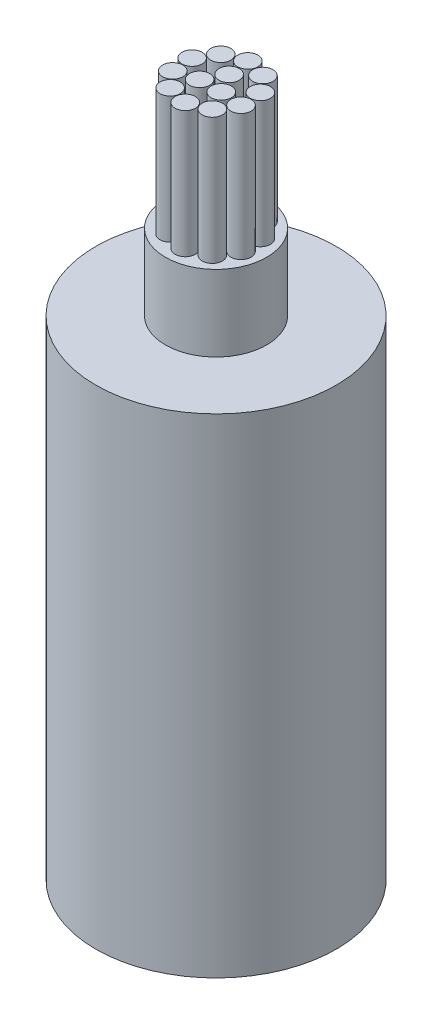
ISO-10303-21;
HEADER;
FILE_DESCRIPTION(('STEP AP214'),'2;1');
FILE_NAME('part.step','',(''),(''),'','','');
FILE_SCHEMA(('AUTOMOTIVE_DESIGN { 1 0 10303 214 1 1 1 1 }'));
ENDSEC;
DATA;
#1=APPLICATION_CONTEXT('core data for automotive mechanical design processes');
#2=APPLICATION_PROTOCOL_DEFINITION('international standard','automotive_design',2000,#1);
#3=PRODUCT_CONTEXT('',#1,'mechanical');
#4=PRODUCT('Part','Part','',(#3));
#5=PRODUCT_RELATED_PRODUCT_CATEGORY('part','',(#4));
#6=PRODUCT_DEFINITION_FORMATION('','',#4);
#7=PRODUCT_DEFINITION_CONTEXT('part definition',#1,'design');
#8=PRODUCT_DEFINITION('design','',#6,#7);
#9=PRODUCT_DEFINITION_SHAPE('','',#8);
#10=(LENGTH_UNIT() NAMED_UNIT(*) SI_UNIT(.MILLI.,.METRE.));
#11=(NAMED_UNIT(*) PLANE_ANGLE_UNIT() SI_UNIT($,.RADIAN.));
#12=(NAMED_UNIT(*) SI_UNIT($,.STERADIAN.) SOLID_ANGLE_UNIT());
#13=UNCERTAINTY_MEASURE_WITH_UNIT(LENGTH_MEASURE(1.E-05),#10,'distance_accuracy_value','');
#14=(GEOMETRIC_REPRESENTATION_CONTEXT(3) GLOBAL_UNCERTAINTY_ASSIGNED_CONTEXT((#13)) GLOBAL_UNIT_ASSIGNED_CONTEXT((#10,
#11,#12)) REPRESENTATION_CONTEXT('',''));
#15=CARTESIAN_POINT('',(0.,0.,0.));
#16=DIRECTION('',(0.,0.,1.));
#17=DIRECTION('',(1.,0.,0.));
#18=AXIS2_PLACEMENT_3D('',#15,#16,#17);
#19=CARTESIAN_POINT('',(0.,-3.5,0.));
#20=DIRECTION('',(0.,1.,0.));
#21=DIRECTION('',(0.,0.,1.));
#22=AXIS2_PLACEMENT_3D('',#19,#20,#21);
#23=CYLINDRICAL_SURFACE('',#22,4.75);
#24=CARTESIAN_POINT('',(0.,19.3,0.));
#25=DIRECTION('',(0.,1.,0.));
#26=DIRECTION('',(0.,0.,1.));
#27=AXIS2_PLACEMENT_3D('',#24,#25,#26);
#28=CIRCLE('',#27,4.75);
#29=CARTESIAN_POINT('',(0.,19.3,4.75));
#30=VERTEX_POINT('',#29);
#31=EDGE_CURVE('E129',#30,#30,#28,.T.);
#32=ORIENTED_EDGE('',*,*,#31,.F.);
#33=EDGE_LOOP('',(#32));
#34=FACE_BOUND('',#33,.T.);
#35=CARTESIAN_POINT('',(0.,0.,0.));
#36=DIRECTION('',(0.,1.,0.));
#37=DIRECTION('',(0.,0.,1.));
#38=AXIS2_PLACEMENT_3D('',#35,#36,#37);
#39=CIRCLE('',#38,4.75);
#40=CARTESIAN_POINT('',(0.,0.,4.75));
#41=VERTEX_POINT('',#40);
#42=EDGE_CURVE('E132',#41,#41,#39,.T.);
#43=ORIENTED_EDGE('',*,*,#42,.T.);
#44=EDGE_LOOP('',(#43));
#45=FACE_BOUND('',#44,.T.);
#46=ADVANCED_FACE('F37',(#34,#45),#23,.T.);
#47=CARTESIAN_POINT('',(0.,22.3,0.));
#48=DIRECTION('',(0.,-1.,0.));
#49=DIRECTION('',(0.,0.,-1.));
#50=AXIS2_PLACEMENT_3D('',#47,#48,#49);
#51=CYLINDRICAL_SURFACE('',#50,2.);
#52=CARTESIAN_POINT('',(0.,22.3,0.));
#53=DIRECTION('',(0.,1.,0.));
#54=DIRECTION('',(0.,0.,1.));
#55=AXIS2_PLACEMENT_3D('',#52,#53,#54);
#56=CIRCLE('',#55,2.);
#57=CARTESIAN_POINT('',(0.,22.3,2.));
#58=VERTEX_POINT('',#57);
#59=EDGE_CURVE('E10',#58,#58,#56,.T.);
#60=ORIENTED_EDGE('',*,*,#59,.F.);
#61=EDGE_LOOP('',(#60));
#62=FACE_BOUND('',#61,.T.);
#63=CARTESIAN_POINT('',(0.,19.3,0.));
#64=DIRECTION('',(0.,1.,0.));
#65=DIRECTION('',(0.,0.,1.));
#66=AXIS2_PLACEMENT_3D('',#63,#64,#65);
#67=CIRCLE('',#66,2.);
#68=CARTESIAN_POINT('',(0.,19.3,2.));
#69=VERTEX_POINT('',#68);
#70=EDGE_CURVE('E124',#69,#69,#67,.T.);
#71=ORIENTED_EDGE('',*,*,#70,.T.);
#72=EDGE_LOOP('',(#71));
#73=FACE_BOUND('',#72,.T.);
#74=ADVANCED_FACE('F146',(#62,#73),#51,.T.);
#75=CARTESIAN_POINT('',(0.,22.3,0.));
#76=DIRECTION('',(0.,1.,0.));
#77=DIRECTION('',(0.,0.,1.));
#78=AXIS2_PLACEMENT_3D('',#75,#76,#77);
#79=PLANE('',#78);
#80=CARTESIAN_POINT('',(0.441742202494932,22.3,0.237271906655678));
#81=DIRECTION('',(0.,1.,0.));
#82=DIRECTION('',(0.,0.,1.));
#83=AXIS2_PLACEMENT_3D('',#80,#81,#82);
#84=CIRCLE('',#83,0.4);
#85=CARTESIAN_POINT('',(0.441742202494932,22.3,0.637271906655679));
#86=VERTEX_POINT('',#85);
#87=EDGE_CURVE('E121',#86,#86,#84,.T.);
#88=ORIENTED_EDGE('',*,*,#87,.F.);
#89=EDGE_LOOP('',(#88));
#90=FACE_BOUND('',#89,.T.);
#91=CARTESIAN_POINT('',(-0.853764908428897,22.3,-1.03916544719868));
#92=DIRECTION('',(0.,1.,0.));
#93=DIRECTION('',(0.,0.,1.));
#94=AXIS2_PLACEMENT_3D('',#91,#92,#93);
#95=CIRCLE('',#94,0.4);
#96=CARTESIAN_POINT('',(-0.853764908428897,22.3,-0.639165447198683));
#97=VERTEX_POINT('',#96);
#98=EDGE_CURVE('E115',#97,#97,#95,.T.);
#99=ORIENTED_EDGE('',*,*,#98,.F.);
#100=EDGE_LOOP('',(#99));
#101=FACE_BOUND('',#100,.T.);
#102=CARTESIAN_POINT('',(-1.29013475974732,22.3,-0.342570218261037));
#103=DIRECTION('',(0.,1.,0.));
#104=DIRECTION('',(0.,0.,1.));
#105=AXIS2_PLACEMENT_3D('',#102,#103,#104);
#106=CIRCLE('',#105,0.4);
#107=CARTESIAN_POINT('',(-1.29013475974732,22.3,0.0574297817389637));
#108=VERTEX_POINT('',#107);
#109=EDGE_CURVE('E109',#108,#108,#106,.T.);
#110=ORIENTED_EDGE('',*,*,#109,.F.);
#111=EDGE_LOOP('',(#110));
#112=FACE_BOUND('',#111,.T.);
#113=CARTESIAN_POINT('',(-1.23371698290995,22.3,0.477478923300058));
#114=DIRECTION('',(0.,1.,0.));
#115=DIRECTION('',(0.,0.,1.));
#116=AXIS2_PLACEMENT_3D('',#113,#114,#115);
#117=CIRCLE('',#116,0.4);
#118=CARTESIAN_POINT('',(-1.23371698290995,22.3,0.877478923300058));
#119=VERTEX_POINT('',#118);
#120=EDGE_CURVE('E103',#119,#119,#117,.T.);
#121=ORIENTED_EDGE('',*,*,#120,.F.);
#122=EDGE_LOOP('',(#121));
#123=FACE_BOUND('',#122,.T.);
#124=CARTESIAN_POINT('',(-0.706061251098955,22.3,1.10775107785344));
#125=DIRECTION('',(0.,1.,0.));
#126=DIRECTION('',(0.,0.,1.));
#127=AXIS2_PLACEMENT_3D('',#124,#125,#126);
#128=CIRCLE('',#127,0.4);
#129=CARTESIAN_POINT('',(-0.706061251098955,22.3,1.50775107785344));
#130=VERTEX_POINT('',#129);
#131=EDGE_CURVE('E97',#130,#130,#128,.T.);
#132=ORIENTED_EDGE('',*,*,#131,.F.);
#133=EDGE_LOOP('',(#132));
#134=FACE_BOUND('',#133,.T.);
#135=CARTESIAN_POINT('',(0.0912858804925712,22.3,1.30750370452233));
#136=DIRECTION('',(0.,1.,0.));
#137=DIRECTION('',(0.,0.,1.));
#138=AXIS2_PLACEMENT_3D('',#135,#136,#137);
#139=CIRCLE('',#138,0.4);
#140=CARTESIAN_POINT('',(0.0912858804925712,22.3,1.70750370452233));
#141=VERTEX_POINT('',#140);
#142=EDGE_CURVE('E91',#141,#141,#139,.T.);
#143=ORIENTED_EDGE('',*,*,#142,.F.);
#144=EDGE_LOOP('',(#143));
#145=FACE_BOUND('',#144,.T.);
#146=CARTESIAN_POINT('',(0.853764908428896,22.3,1.0004380892613));
#147=DIRECTION('',(0.,1.,0.));
#148=DIRECTION('',(0.,0.,1.));
#149=AXIS2_PLACEMENT_3D('',#146,#147,#148);
#150=CIRCLE('',#149,0.400000000000001);
#151=CARTESIAN_POINT('',(0.853764908428896,22.3,1.4004380892613));
#152=VERTEX_POINT('',#151);
#153=EDGE_CURVE('E85',#152,#152,#150,.T.);
#154=ORIENTED_EDGE('',*,*,#153,.F.);
#155=EDGE_LOOP('',(#154));
#156=FACE_BOUND('',#155,.T.);
#157=CARTESIAN_POINT('',(1.29013475974732,22.3,0.303842860323657));
#158=DIRECTION('',(0.,1.,0.));
#159=DIRECTION('',(0.,0.,1.));
#160=AXIS2_PLACEMENT_3D('',#157,#158,#159);
#161=CIRCLE('',#160,0.4);
#162=CARTESIAN_POINT('',(1.29013475974732,22.3,0.703842860323657));
#163=VERTEX_POINT('',#162);
#164=EDGE_CURVE('E79',#163,#163,#161,.T.);
#165=ORIENTED_EDGE('',*,*,#164,.F.);
#166=EDGE_LOOP('',(#165));
#167=FACE_BOUND('',#166,.T.);
#168=CARTESIAN_POINT('',(1.23371698290995,22.3,-0.516206281237438));
#169=DIRECTION('',(0.,1.,0.));
#170=DIRECTION('',(0.,0.,1.));
#171=AXIS2_PLACEMENT_3D('',#168,#169,#170);
#172=CIRCLE('',#171,0.4);
#173=CARTESIAN_POINT('',(1.23371698290995,22.3,-0.116206281237438));
#174=VERTEX_POINT('',#173);
#175=EDGE_CURVE('E73',#174,#174,#172,.T.);
#176=ORIENTED_EDGE('',*,*,#175,.F.);
#177=EDGE_LOOP('',(#176));
#178=FACE_BOUND('',#177,.T.);
#179=CARTESIAN_POINT('',(0.706061251098955,22.3,-1.14647843579082));
#180=DIRECTION('',(0.,1.,0.));
#181=DIRECTION('',(0.,0.,1.));
#182=AXIS2_PLACEMENT_3D('',#179,#180,#181);
#183=CIRCLE('',#182,0.400000000000001);
#184=CARTESIAN_POINT('',(0.706061251098955,22.3,-0.746478435790816));
#185=VERTEX_POINT('',#184);
#186=EDGE_CURVE('E67',#185,#185,#183,.T.);
#187=ORIENTED_EDGE('',*,*,#186,.F.);
#188=EDGE_LOOP('',(#187));
#189=FACE_BOUND('',#188,.T.);
#190=CARTESIAN_POINT('',(0.,22.3,-0.516206281237438));
#191=DIRECTION('',(0.,1.,0.));
#192=DIRECTION('',(0.,0.,1.));
#193=AXIS2_PLACEMENT_3D('',#190,#191,#192);
#194=CIRCLE('',#193,0.4);
#195=CARTESIAN_POINT('',(0.,22.3,-0.116206281237438));
#196=VERTEX_POINT('',#195);
#197=EDGE_CURVE('E61',#196,#196,#194,.T.);
#198=ORIENTED_EDGE('',*,*,#197,.F.);
#199=EDGE_LOOP('',(#198));
#200=FACE_BOUND('',#199,.T.);
#201=CARTESIAN_POINT('',(-0.0912858804925711,22.3,-1.34623106245971));
#202=DIRECTION('',(0.,1.,0.));
#203=DIRECTION('',(0.,0.,1.));
#204=AXIS2_PLACEMENT_3D('',#201,#202,#203);
#205=CIRCLE('',#204,0.4);
#206=CARTESIAN_POINT('',(-0.0912858804925711,22.3,-0.946231062459715));
#207=VERTEX_POINT('',#206);
#208=EDGE_CURVE('E55',#207,#207,#205,.T.);
#209=ORIENTED_EDGE('',*,*,#208,.F.);
#210=EDGE_LOOP('',(#209));
#211=FACE_BOUND('',#210,.T.);
#212=CARTESIAN_POINT('',(-0.411452740158857,22.3,0.237271906655678));
#213=DIRECTION('',(0.,1.,0.));
#214=DIRECTION('',(0.,0.,1.));
#215=AXIS2_PLACEMENT_3D('',#212,#213,#214);
#216=CIRCLE('',#215,0.4);
#217=CARTESIAN_POINT('',(-0.411452740158857,22.3,0.637271906655678));
#218=VERTEX_POINT('',#217);
#219=EDGE_CURVE('E48',#218,#218,#216,.T.);
#220=ORIENTED_EDGE('',*,*,#219,.F.);
#221=EDGE_LOOP('',(#220));
#222=FACE_BOUND('',#221,.T.);
#223=ORIENTED_EDGE('',*,*,#59,.T.);
#224=EDGE_LOOP('',(#223));
#225=FACE_BOUND('',#224,.T.);
#226=ADVANCED_FACE('F152',(#90,#101,#112,#123,#134,#145,#156,#167,#178,#189,#200,#211,#222,
#225),#79,.T.);
#227=CARTESIAN_POINT('',(-0.411452740158857,27.3,0.237271906655678));
#228=DIRECTION('',(0.,-1.,0.));
#229=DIRECTION('',(0.,0.,-1.));
#230=AXIS2_PLACEMENT_3D('',#227,#228,#229);
#231=CYLINDRICAL_SURFACE('',#230,0.4);
#232=CARTESIAN_POINT('',(-0.411452740158857,27.3,0.237271906655678));
#233=DIRECTION('',(0.,1.,0.));
#234=DIRECTION('',(0.,0.,1.));
#235=AXIS2_PLACEMENT_3D('',#232,#233,#234);
#236=CIRCLE('',#235,0.4);
#237=CARTESIAN_POINT('',(-0.411452740158857,27.3,0.637271906655678));
#238=VERTEX_POINT('',#237);
#239=EDGE_CURVE('E44',#238,#238,#236,.T.);
#240=ORIENTED_EDGE('',*,*,#239,.F.);
#241=EDGE_LOOP('',(#240));
#242=FACE_BOUND('',#241,.T.);
#243=ORIENTED_EDGE('',*,*,#219,.T.);
#244=EDGE_LOOP('',(#243));
#245=FACE_BOUND('',#244,.T.);
#246=ADVANCED_FACE('F254',(#242,#245),#231,.T.);
#247=CARTESIAN_POINT('',(-0.411452740158857,27.3,0.237271906655678));
#248=DIRECTION('',(0.,1.,0.));
#249=DIRECTION('',(0.,0.,1.));
#250=AXIS2_PLACEMENT_3D('',#247,#248,#249);
#251=PLANE('',#250);
#252=ORIENTED_EDGE('',*,*,#239,.T.);
#253=EDGE_LOOP('',(#252));
#254=FACE_BOUND('',#253,.T.);
#255=ADVANCED_FACE('F250',(#254),#251,.T.);
#256=CARTESIAN_POINT('',(-0.0912858804925711,27.3,-1.34623106245971));
#257=DIRECTION('',(0.,-1.,0.));
#258=DIRECTION('',(0.,0.,-1.));
#259=AXIS2_PLACEMENT_3D('',#256,#257,#258);
#260=CYLINDRICAL_SURFACE('',#259,0.4);
#261=CARTESIAN_POINT('',(-0.0912858804925711,27.3,-1.34623106245971));
#262=DIRECTION('',(0.,1.,0.));
#263=DIRECTION('',(0.,0.,1.));
#264=AXIS2_PLACEMENT_3D('',#261,#262,#263);
#265=CIRCLE('',#264,0.4);
#266=CARTESIAN_POINT('',(-0.0912858804925711,27.3,-0.946231062459715));
#267=VERTEX_POINT('',#266);
#268=EDGE_CURVE('E53',#267,#267,#265,.T.);
#269=ORIENTED_EDGE('',*,*,#268,.F.);
#270=EDGE_LOOP('',(#269));
#271=FACE_BOUND('',#270,.T.);
#272=ORIENTED_EDGE('',*,*,#208,.T.);
#273=EDGE_LOOP('',(#272));
#274=FACE_BOUND('',#273,.T.);
#275=ADVANCED_FACE('F246',(#271,#274),#260,.T.);
#276=CARTESIAN_POINT('',(-0.0912858804925711,27.3,-1.34623106245971));
#277=DIRECTION('',(0.,1.,0.));
#278=DIRECTION('',(0.,0.,1.));
#279=AXIS2_PLACEMENT_3D('',#276,#277,#278);
#280=PLANE('',#279);
#281=ORIENTED_EDGE('',*,*,#268,.T.);
#282=EDGE_LOOP('',(#281));
#283=FACE_BOUND('',#282,.T.);
#284=ADVANCED_FACE('F242',(#283),#280,.T.);
#285=CARTESIAN_POINT('',(0.,27.3,-0.516206281237438));
#286=DIRECTION('',(0.,-1.,0.));
#287=DIRECTION('',(0.,0.,-1.));
#288=AXIS2_PLACEMENT_3D('',#285,#286,#287);
#289=CYLINDRICAL_SURFACE('',#288,0.4);
#290=CARTESIAN_POINT('',(0.,27.3,-0.516206281237438));
#291=DIRECTION('',(0.,1.,0.));
#292=DIRECTION('',(0.,0.,1.));
#293=AXIS2_PLACEMENT_3D('',#290,#291,#292);
#294=CIRCLE('',#293,0.4);
#295=CARTESIAN_POINT('',(0.,27.3,-0.116206281237438));
#296=VERTEX_POINT('',#295);
#297=EDGE_CURVE('E58',#296,#296,#294,.T.);
#298=ORIENTED_EDGE('',*,*,#297,.F.);
#299=EDGE_LOOP('',(#298));
#300=FACE_BOUND('',#299,.T.);
#301=ORIENTED_EDGE('',*,*,#197,.T.);
#302=EDGE_LOOP('',(#301));
#303=FACE_BOUND('',#302,.T.);
#304=ADVANCED_FACE('F238',(#300,#303),#289,.T.);
#305=CARTESIAN_POINT('',(0.,27.3,-0.516206281237438));
#306=DIRECTION('',(0.,1.,0.));
#307=DIRECTION('',(0.,0.,1.));
#308=AXIS2_PLACEMENT_3D('',#305,#306,#307);
#309=PLANE('',#308);
#310=ORIENTED_EDGE('',*,*,#297,.T.);
#311=EDGE_LOOP('',(#310));
#312=FACE_BOUND('',#311,.T.);
#313=ADVANCED_FACE('F234',(#312),#309,.T.);
#314=CARTESIAN_POINT('',(0.706061251098955,27.3,-1.14647843579082));
#315=DIRECTION('',(0.,-1.,0.));
#316=DIRECTION('',(0.,0.,-1.));
#317=AXIS2_PLACEMENT_3D('',#314,#315,#316);
#318=CYLINDRICAL_SURFACE('',#317,0.400000000000001);
#319=CARTESIAN_POINT('',(0.706061251098955,27.3,-1.14647843579082));
#320=DIRECTION('',(0.,1.,0.));
#321=DIRECTION('',(0.,0.,1.));
#322=AXIS2_PLACEMENT_3D('',#319,#320,#321);
#323=CIRCLE('',#322,0.400000000000001);
#324=CARTESIAN_POINT('',(0.706061251098955,27.3,-0.746478435790816));
#325=VERTEX_POINT('',#324);
#326=EDGE_CURVE('E64',#325,#325,#323,.T.);
#327=ORIENTED_EDGE('',*,*,#326,.F.);
#328=EDGE_LOOP('',(#327));
#329=FACE_BOUND('',#328,.T.);
#330=ORIENTED_EDGE('',*,*,#186,.T.);
#331=EDGE_LOOP('',(#330));
#332=FACE_BOUND('',#331,.T.);
#333=ADVANCED_FACE('F230',(#329,#332),#318,.T.);
#334=CARTESIAN_POINT('',(0.706061251098955,27.3,-1.14647843579082));
#335=DIRECTION('',(0.,1.,0.));
#336=DIRECTION('',(0.,0.,1.));
#337=AXIS2_PLACEMENT_3D('',#334,#335,#336);
#338=PLANE('',#337);
#339=ORIENTED_EDGE('',*,*,#326,.T.);
#340=EDGE_LOOP('',(#339));
#341=FACE_BOUND('',#340,.T.);
#342=ADVANCED_FACE('F226',(#341),#338,.T.);
#343=CARTESIAN_POINT('',(1.23371698290995,27.3,-0.516206281237438));
#344=DIRECTION('',(0.,-1.,0.));
#345=DIRECTION('',(0.,0.,-1.));
#346=AXIS2_PLACEMENT_3D('',#343,#344,#345);
#347=CYLINDRICAL_SURFACE('',#346,0.4);
#348=CARTESIAN_POINT('',(1.23371698290995,27.3,-0.516206281237438));
#349=DIRECTION('',(0.,1.,0.));
#350=DIRECTION('',(0.,0.,1.));
#351=AXIS2_PLACEMENT_3D('',#348,#349,#350);
#352=CIRCLE('',#351,0.4);
#353=CARTESIAN_POINT('',(1.23371698290995,27.3,-0.116206281237438));
#354=VERTEX_POINT('',#353);
#355=EDGE_CURVE('E70',#354,#354,#352,.T.);
#356=ORIENTED_EDGE('',*,*,#355,.F.);
#357=EDGE_LOOP('',(#356));
#358=FACE_BOUND('',#357,.T.);
#359=ORIENTED_EDGE('',*,*,#175,.T.);
#360=EDGE_LOOP('',(#359));
#361=FACE_BOUND('',#360,.T.);
#362=ADVANCED_FACE('F222',(#358,#361),#347,.T.);
#363=CARTESIAN_POINT('',(1.23371698290995,27.3,-0.516206281237438));
#364=DIRECTION('',(0.,1.,0.));
#365=DIRECTION('',(0.,0.,1.));
#366=AXIS2_PLACEMENT_3D('',#363,#364,#365);
#367=PLANE('',#366);
#368=ORIENTED_EDGE('',*,*,#355,.T.);
#369=EDGE_LOOP('',(#368));
#370=FACE_BOUND('',#369,.T.);
#371=ADVANCED_FACE('F218',(#370),#367,.T.);
#372=CARTESIAN_POINT('',(1.29013475974732,27.3,0.303842860323657));
#373=DIRECTION('',(0.,-1.,0.));
#374=DIRECTION('',(0.,0.,-1.));
#375=AXIS2_PLACEMENT_3D('',#372,#373,#374);
#376=CYLINDRICAL_SURFACE('',#375,0.4);
#377=CARTESIAN_POINT('',(1.29013475974732,27.3,0.303842860323657));
#378=DIRECTION('',(0.,1.,0.));
#379=DIRECTION('',(0.,0.,1.));
#380=AXIS2_PLACEMENT_3D('',#377,#378,#379);
#381=CIRCLE('',#380,0.4);
#382=CARTESIAN_POINT('',(1.29013475974732,27.3,0.703842860323657));
#383=VERTEX_POINT('',#382);
#384=EDGE_CURVE('E76',#383,#383,#381,.T.);
#385=ORIENTED_EDGE('',*,*,#384,.F.);
#386=EDGE_LOOP('',(#385));
#387=FACE_BOUND('',#386,.T.);
#388=ORIENTED_EDGE('',*,*,#164,.T.);
#389=EDGE_LOOP('',(#388));
#390=FACE_BOUND('',#389,.T.);
#391=ADVANCED_FACE('F214',(#387,#390),#376,.T.);
#392=CARTESIAN_POINT('',(1.29013475974732,27.3,0.303842860323657));
#393=DIRECTION('',(0.,1.,0.));
#394=DIRECTION('',(0.,0.,1.));
#395=AXIS2_PLACEMENT_3D('',#392,#393,#394);
#396=PLANE('',#395);
#397=ORIENTED_EDGE('',*,*,#384,.T.);
#398=EDGE_LOOP('',(#397));
#399=FACE_BOUND('',#398,.T.);
#400=ADVANCED_FACE('F210',(#399),#396,.T.);
#401=CARTESIAN_POINT('',(0.853764908428896,27.3,1.0004380892613));
#402=DIRECTION('',(0.,-1.,0.));
#403=DIRECTION('',(0.,0.,-1.));
#404=AXIS2_PLACEMENT_3D('',#401,#402,#403);
#405=CYLINDRICAL_SURFACE('',#404,0.400000000000001);
#406=CARTESIAN_POINT('',(0.853764908428896,27.3,1.0004380892613));
#407=DIRECTION('',(0.,1.,0.));
#408=DIRECTION('',(0.,0.,1.));
#409=AXIS2_PLACEMENT_3D('',#406,#407,#408);
#410=CIRCLE('',#409,0.400000000000001);
#411=CARTESIAN_POINT('',(0.853764908428896,27.3,1.4004380892613));
#412=VERTEX_POINT('',#411);
#413=EDGE_CURVE('E82',#412,#412,#410,.T.);
#414=ORIENTED_EDGE('',*,*,#413,.F.);
#415=EDGE_LOOP('',(#414));
#416=FACE_BOUND('',#415,.T.);
#417=ORIENTED_EDGE('',*,*,#153,.T.);
#418=EDGE_LOOP('',(#417));
#419=FACE_BOUND('',#418,.T.);
#420=ADVANCED_FACE('F206',(#416,#419),#405,.T.);
#421=CARTESIAN_POINT('',(0.853764908428896,27.3,1.0004380892613));
#422=DIRECTION('',(0.,1.,0.));
#423=DIRECTION('',(0.,0.,1.));
#424=AXIS2_PLACEMENT_3D('',#421,#422,#423);
#425=PLANE('',#424);
#426=ORIENTED_EDGE('',*,*,#413,.T.);
#427=EDGE_LOOP('',(#426));
#428=FACE_BOUND('',#427,.T.);
#429=ADVANCED_FACE('F202',(#428),#425,.T.);
#430=CARTESIAN_POINT('',(0.0912858804925712,27.3,1.30750370452233));
#431=DIRECTION('',(0.,-1.,0.));
#432=DIRECTION('',(0.,0.,-1.));
#433=AXIS2_PLACEMENT_3D('',#430,#431,#432);
#434=CYLINDRICAL_SURFACE('',#433,0.4);
#435=CARTESIAN_POINT('',(0.0912858804925712,27.3,1.30750370452233));
#436=DIRECTION('',(0.,1.,0.));
#437=DIRECTION('',(0.,0.,1.));
#438=AXIS2_PLACEMENT_3D('',#435,#436,#437);
#439=CIRCLE('',#438,0.4);
#440=CARTESIAN_POINT('',(0.0912858804925712,27.3,1.70750370452233));
#441=VERTEX_POINT('',#440);
#442=EDGE_CURVE('E88',#441,#441,#439,.T.);
#443=ORIENTED_EDGE('',*,*,#442,.F.);
#444=EDGE_LOOP('',(#443));
#445=FACE_BOUND('',#444,.T.);
#446=ORIENTED_EDGE('',*,*,#142,.T.);
#447=EDGE_LOOP('',(#446));
#448=FACE_BOUND('',#447,.T.);
#449=ADVANCED_FACE('F198',(#445,#448),#434,.T.);
#450=CARTESIAN_POINT('',(0.0912858804925712,27.3,1.30750370452233));
#451=DIRECTION('',(0.,1.,0.));
#452=DIRECTION('',(0.,0.,1.));
#453=AXIS2_PLACEMENT_3D('',#450,#451,#452);
#454=PLANE('',#453);
#455=ORIENTED_EDGE('',*,*,#442,.T.);
#456=EDGE_LOOP('',(#455));
#457=FACE_BOUND('',#456,.T.);
#458=ADVANCED_FACE('F194',(#457),#454,.T.);
#459=CARTESIAN_POINT('',(-0.706061251098955,27.3,1.10775107785344));
#460=DIRECTION('',(0.,-1.,0.));
#461=DIRECTION('',(0.,0.,-1.));
#462=AXIS2_PLACEMENT_3D('',#459,#460,#461);
#463=CYLINDRICAL_SURFACE('',#462,0.4);
#464=CARTESIAN_POINT('',(-0.706061251098955,27.3,1.10775107785344));
#465=DIRECTION('',(0.,1.,0.));
#466=DIRECTION('',(0.,0.,1.));
#467=AXIS2_PLACEMENT_3D('',#464,#465,#466);
#468=CIRCLE('',#467,0.4);
#469=CARTESIAN_POINT('',(-0.706061251098955,27.3,1.50775107785344));
#470=VERTEX_POINT('',#469);
#471=EDGE_CURVE('E94',#470,#470,#468,.T.);
#472=ORIENTED_EDGE('',*,*,#471,.F.);
#473=EDGE_LOOP('',(#472));
#474=FACE_BOUND('',#473,.T.);
#475=ORIENTED_EDGE('',*,*,#131,.T.);
#476=EDGE_LOOP('',(#475));
#477=FACE_BOUND('',#476,.T.);
#478=ADVANCED_FACE('F190',(#474,#477),#463,.T.);
#479=CARTESIAN_POINT('',(-0.706061251098955,27.3,1.10775107785344));
#480=DIRECTION('',(0.,1.,0.));
#481=DIRECTION('',(0.,0.,1.));
#482=AXIS2_PLACEMENT_3D('',#479,#480,#481);
#483=PLANE('',#482);
#484=ORIENTED_EDGE('',*,*,#471,.T.);
#485=EDGE_LOOP('',(#484));
#486=FACE_BOUND('',#485,.T.);
#487=ADVANCED_FACE('F186',(#486),#483,.T.);
#488=CARTESIAN_POINT('',(-1.23371698290995,27.3,0.477478923300058));
#489=DIRECTION('',(0.,-1.,0.));
#490=DIRECTION('',(0.,0.,-1.));
#491=AXIS2_PLACEMENT_3D('',#488,#489,#490);
#492=CYLINDRICAL_SURFACE('',#491,0.4);
#493=CARTESIAN_POINT('',(-1.23371698290995,27.3,0.477478923300058));
#494=DIRECTION('',(0.,1.,0.));
#495=DIRECTION('',(0.,0.,1.));
#496=AXIS2_PLACEMENT_3D('',#493,#494,#495);
#497=CIRCLE('',#496,0.4);
#498=CARTESIAN_POINT('',(-1.23371698290995,27.3,0.877478923300058));
#499=VERTEX_POINT('',#498);
#500=EDGE_CURVE('E100',#499,#499,#497,.T.);
#501=ORIENTED_EDGE('',*,*,#500,.F.);
#502=EDGE_LOOP('',(#501));
#503=FACE_BOUND('',#502,.T.);
#504=ORIENTED_EDGE('',*,*,#120,.T.);
#505=EDGE_LOOP('',(#504));
#506=FACE_BOUND('',#505,.T.);
#507=ADVANCED_FACE('F182',(#503,#506),#492,.T.);
#508=CARTESIAN_POINT('',(-1.23371698290995,27.3,0.477478923300058));
#509=DIRECTION('',(0.,1.,0.));
#510=DIRECTION('',(0.,0.,1.));
#511=AXIS2_PLACEMENT_3D('',#508,#509,#510);
#512=PLANE('',#511);
#513=ORIENTED_EDGE('',*,*,#500,.T.);
#514=EDGE_LOOP('',(#513));
#515=FACE_BOUND('',#514,.T.);
#516=ADVANCED_FACE('F178',(#515),#512,.T.);
#517=CARTESIAN_POINT('',(-1.29013475974732,27.3,-0.342570218261037));
#518=DIRECTION('',(0.,-1.,0.));
#519=DIRECTION('',(0.,0.,-1.));
#520=AXIS2_PLACEMENT_3D('',#517,#518,#519);
#521=CYLINDRICAL_SURFACE('',#520,0.4);
#522=CARTESIAN_POINT('',(-1.29013475974732,27.3,-0.342570218261037));
#523=DIRECTION('',(0.,1.,0.));
#524=DIRECTION('',(0.,0.,1.));
#525=AXIS2_PLACEMENT_3D('',#522,#523,#524);
#526=CIRCLE('',#525,0.4);
#527=CARTESIAN_POINT('',(-1.29013475974732,27.3,0.0574297817389637));
#528=VERTEX_POINT('',#527);
#529=EDGE_CURVE('E106',#528,#528,#526,.T.);
#530=ORIENTED_EDGE('',*,*,#529,.F.);
#531=EDGE_LOOP('',(#530));
#532=FACE_BOUND('',#531,.T.);
#533=ORIENTED_EDGE('',*,*,#109,.T.);
#534=EDGE_LOOP('',(#533));
#535=FACE_BOUND('',#534,.T.);
#536=ADVANCED_FACE('F174',(#532,#535),#521,.T.);
#537=CARTESIAN_POINT('',(-1.29013475974732,27.3,-0.342570218261037));
#538=DIRECTION('',(0.,1.,0.));
#539=DIRECTION('',(0.,0.,1.));
#540=AXIS2_PLACEMENT_3D('',#537,#538,#539);
#541=PLANE('',#540);
#542=ORIENTED_EDGE('',*,*,#529,.T.);
#543=EDGE_LOOP('',(#542));
#544=FACE_BOUND('',#543,.T.);
#545=ADVANCED_FACE('F170',(#544),#541,.T.);
#546=CARTESIAN_POINT('',(-0.853764908428897,27.3,-1.03916544719868));
#547=DIRECTION('',(0.,-1.,0.));
#548=DIRECTION('',(0.,0.,-1.));
#549=AXIS2_PLACEMENT_3D('',#546,#547,#548);
#550=CYLINDRICAL_SURFACE('',#549,0.4);
#551=CARTESIAN_POINT('',(-0.853764908428897,27.3,-1.03916544719868));
#552=DIRECTION('',(0.,1.,0.));
#553=DIRECTION('',(0.,0.,1.));
#554=AXIS2_PLACEMENT_3D('',#551,#552,#553);
#555=CIRCLE('',#554,0.4);
#556=CARTESIAN_POINT('',(-0.853764908428897,27.3,-0.639165447198683));
#557=VERTEX_POINT('',#556);
#558=EDGE_CURVE('E112',#557,#557,#555,.T.);
#559=ORIENTED_EDGE('',*,*,#558,.F.);
#560=EDGE_LOOP('',(#559));
#561=FACE_BOUND('',#560,.T.);
#562=ORIENTED_EDGE('',*,*,#98,.T.);
#563=EDGE_LOOP('',(#562));
#564=FACE_BOUND('',#563,.T.);
#565=ADVANCED_FACE('F166',(#561,#564),#550,.T.);
#566=CARTESIAN_POINT('',(-0.853764908428897,27.3,-1.03916544719868));
#567=DIRECTION('',(0.,1.,0.));
#568=DIRECTION('',(0.,0.,1.));
#569=AXIS2_PLACEMENT_3D('',#566,#567,#568);
#570=PLANE('',#569);
#571=ORIENTED_EDGE('',*,*,#558,.T.);
#572=EDGE_LOOP('',(#571));
#573=FACE_BOUND('',#572,.T.);
#574=ADVANCED_FACE('F162',(#573),#570,.T.);
#575=CARTESIAN_POINT('',(0.441742202494932,27.3,0.237271906655678));
#576=DIRECTION('',(0.,-1.,0.));
#577=DIRECTION('',(0.,0.,-1.));
#578=AXIS2_PLACEMENT_3D('',#575,#576,#577);
#579=CYLINDRICAL_SURFACE('',#578,0.4);
#580=CARTESIAN_POINT('',(0.441742202494932,27.3,0.237271906655678));
#581=DIRECTION('',(0.,1.,0.));
#582=DIRECTION('',(0.,0.,1.));
#583=AXIS2_PLACEMENT_3D('',#580,#581,#582);
#584=CIRCLE('',#583,0.4);
#585=CARTESIAN_POINT('',(0.441742202494932,27.3,0.637271906655679));
#586=VERTEX_POINT('',#585);
#587=EDGE_CURVE('E118',#586,#586,#584,.T.);
#588=ORIENTED_EDGE('',*,*,#587,.F.);
#589=EDGE_LOOP('',(#588));
#590=FACE_BOUND('',#589,.T.);
#591=ORIENTED_EDGE('',*,*,#87,.T.);
#592=EDGE_LOOP('',(#591));
#593=FACE_BOUND('',#592,.T.);
#594=ADVANCED_FACE('F158',(#590,#593),#579,.T.);
#595=CARTESIAN_POINT('',(0.441742202494932,27.3,0.237271906655678));
#596=DIRECTION('',(0.,1.,0.));
#597=DIRECTION('',(0.,0.,1.));
#598=AXIS2_PLACEMENT_3D('',#595,#596,#597);
#599=PLANE('',#598);
#600=ORIENTED_EDGE('',*,*,#587,.T.);
#601=EDGE_LOOP('',(#600));
#602=FACE_BOUND('',#601,.T.);
#603=ADVANCED_FACE('F142',(#602),#599,.T.);
#604=CARTESIAN_POINT('',(0.,19.3,0.));
#605=DIRECTION('',(0.,1.,0.));
#606=DIRECTION('',(0.,0.,1.));
#607=AXIS2_PLACEMENT_3D('',#604,#605,#606);
#608=PLANE('',#607);
#609=ORIENTED_EDGE('',*,*,#70,.F.);
#610=EDGE_LOOP('',(#609));
#611=FACE_BOUND('',#610,.T.);
#612=ORIENTED_EDGE('',*,*,#31,.T.);
#613=EDGE_LOOP('',(#612));
#614=FACE_BOUND('',#613,.T.);
#615=ADVANCED_FACE('F138',(#611,#614),#608,.T.);
#616=CARTESIAN_POINT('',(0.,0.,0.));
#617=DIRECTION('',(0.,1.,0.));
#618=DIRECTION('',(0.,0.,1.));
#619=AXIS2_PLACEMENT_3D('',#616,#617,#618);
#620=PLANE('',#619);
#621=ORIENTED_EDGE('',*,*,#42,.F.);
#622=EDGE_LOOP('',(#621));
#623=FACE_BOUND('',#622,.T.);
#624=ADVANCED_FACE('F39',(#623),#620,.F.);
#625=CLOSED_SHELL('',(#46,#74,#226,#246,#255,#275,#284,#304,#313,#333,#342,#362,#371,#391,#400,
#420,#429,#449,#458,#478,#487,#507,#516,#536,#545,#565,#574,#594,#603,#615,#624));
#626=MANIFOLD_SOLID_BREP('B2',#625);
#627=ADVANCED_BREP_SHAPE_REPRESENTATION('',(#18,#626),#14);
#628=SHAPE_DEFINITION_REPRESENTATION(#9,#627);
ENDSEC;
END-ISO-10303-21;
